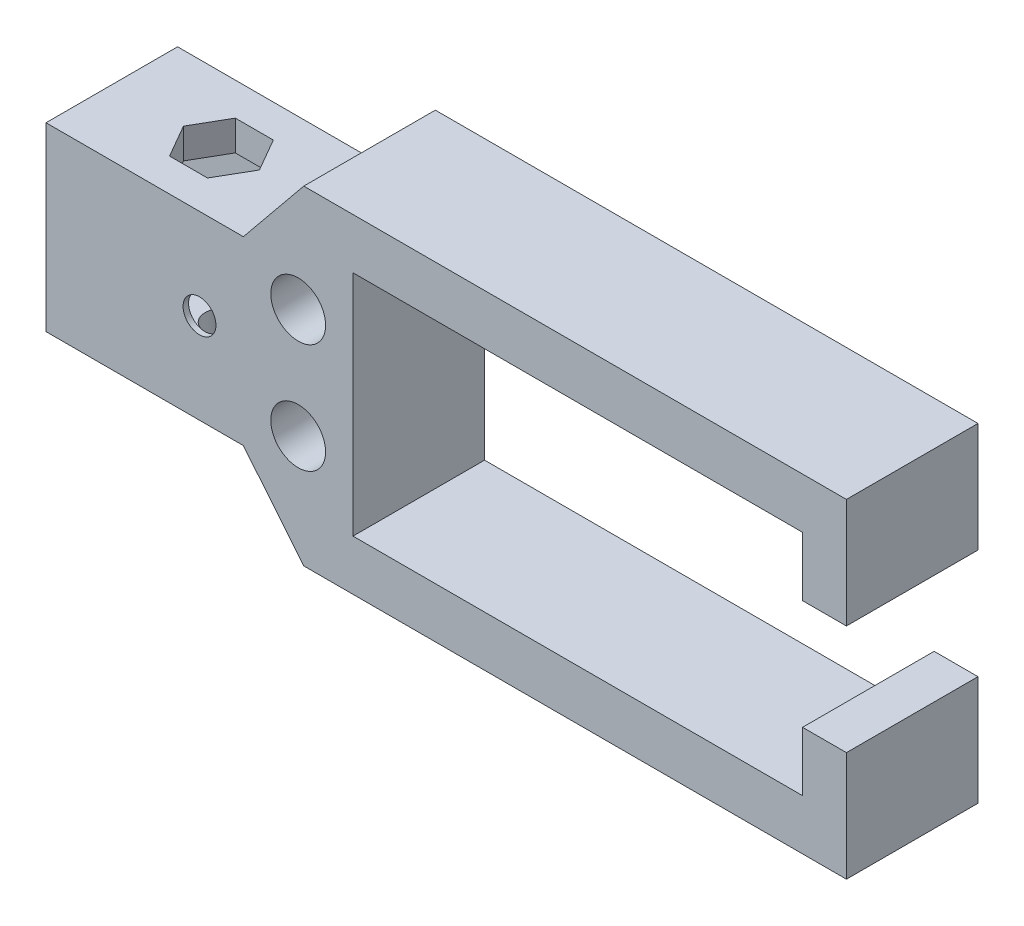
ISO-10303-21;
HEADER;
FILE_DESCRIPTION(('STEP AP214'),'2;1');
FILE_NAME('part.step','',(''),(''),'','','');
FILE_SCHEMA(('AUTOMOTIVE_DESIGN { 1 0 10303 214 1 1 1 1 }'));
ENDSEC;
DATA;
#1=APPLICATION_CONTEXT('core data for automotive mechanical design processes');
#2=APPLICATION_PROTOCOL_DEFINITION('international standard','automotive_design',2000,#1);
#3=PRODUCT_CONTEXT('',#1,'mechanical');
#4=PRODUCT('Part','Part','',(#3));
#5=PRODUCT_RELATED_PRODUCT_CATEGORY('part','',(#4));
#6=PRODUCT_DEFINITION_FORMATION('','',#4);
#7=PRODUCT_DEFINITION_CONTEXT('part definition',#1,'design');
#8=PRODUCT_DEFINITION('design','',#6,#7);
#9=PRODUCT_DEFINITION_SHAPE('','',#8);
#10=(LENGTH_UNIT() NAMED_UNIT(*) SI_UNIT(.MILLI.,.METRE.));
#11=(NAMED_UNIT(*) PLANE_ANGLE_UNIT() SI_UNIT($,.RADIAN.));
#12=(NAMED_UNIT(*) SI_UNIT($,.STERADIAN.) SOLID_ANGLE_UNIT());
#13=UNCERTAINTY_MEASURE_WITH_UNIT(LENGTH_MEASURE(1.E-05),#10,'distance_accuracy_value','');
#14=(GEOMETRIC_REPRESENTATION_CONTEXT(3) GLOBAL_UNCERTAINTY_ASSIGNED_CONTEXT((#13)) GLOBAL_UNIT_ASSIGNED_CONTEXT((#10,
#11,#12)) REPRESENTATION_CONTEXT('',''));
#15=CARTESIAN_POINT('',(0.,0.,0.));
#16=DIRECTION('',(0.,0.,1.));
#17=DIRECTION('',(1.,0.,0.));
#18=AXIS2_PLACEMENT_3D('',#15,#16,#17);
#19=CARTESIAN_POINT('',(0.,0.,0.));
#20=DIRECTION('',(0.,0.,1.));
#21=DIRECTION('',(1.,0.,0.));
#22=AXIS2_PLACEMENT_3D('',#19,#20,#21);
#23=PLANE('',#22);
#24=CARTESIAN_POINT('',(-15.,-5.,0.));
#25=DIRECTION('',(0.,0.,-1.));
#26=DIRECTION('',(-1.,0.,0.));
#27=AXIS2_PLACEMENT_3D('',#24,#25,#26);
#28=CIRCLE('',#27,2.5);
#29=CARTESIAN_POINT('',(-17.5,-5.,0.));
#30=VERTEX_POINT('',#29);
#31=EDGE_CURVE('E272',#30,#30,#28,.T.);
#32=ORIENTED_EDGE('',*,*,#31,.F.);
#33=EDGE_LOOP('',(#32));
#34=FACE_BOUND('',#33,.T.);
#35=CARTESIAN_POINT('',(-15.,5.,0.));
#36=DIRECTION('',(0.,0.,1.));
#37=DIRECTION('',(-1.,0.,0.));
#38=AXIS2_PLACEMENT_3D('',#35,#36,#37);
#39=CIRCLE('',#38,2.5);
#40=CARTESIAN_POINT('',(-17.5,5.,0.));
#41=VERTEX_POINT('',#40);
#42=EDGE_CURVE('E268',#41,#41,#39,.T.);
#43=ORIENTED_EDGE('',*,*,#42,.T.);
#44=EDGE_LOOP('',(#43));
#45=FACE_BOUND('',#44,.T.);
#46=DIRECTION('',(-0.632264439062889,0.774752656721157,0.));
#47=VECTOR('',#46,1.);
#48=CARTESIAN_POINT('',(-20.,-8.25,0.));
#49=LINE('',#48,#47);
#50=CARTESIAN_POINT('',(-14.4914226151398,-15.,0.));
#51=VERTEX_POINT('',#50);
#52=CARTESIAN_POINT('',(-20.,-8.25,0.));
#53=VERTEX_POINT('',#52);
#54=EDGE_CURVE('E253',#51,#53,#49,.T.);
#55=ORIENTED_EDGE('',*,*,#54,.T.);
#56=DIRECTION('',(-1.,0.,0.));
#57=VECTOR('',#56,1.);
#58=CARTESIAN_POINT('',(-20.,-8.25,0.));
#59=LINE('',#58,#57);
#60=CARTESIAN_POINT('',(-38.,-8.25,0.));
#61=VERTEX_POINT('',#60);
#62=EDGE_CURVE('E397',#53,#61,#59,.T.);
#63=ORIENTED_EDGE('',*,*,#62,.T.);
#64=DIRECTION('',(0.,-1.,0.));
#65=VECTOR('',#64,1.);
#66=CARTESIAN_POINT('',(-38.,10.25,0.));
#67=LINE('',#66,#65);
#68=CARTESIAN_POINT('',(-38.,8.25,0.));
#69=VERTEX_POINT('',#68);
#70=EDGE_CURVE('E412',#69,#61,#67,.T.);
#71=ORIENTED_EDGE('',*,*,#70,.F.);
#72=DIRECTION('',(-1.,0.,0.));
#73=VECTOR('',#72,1.);
#74=CARTESIAN_POINT('',(-20.,8.25,0.));
#75=LINE('',#74,#73);
#76=CARTESIAN_POINT('',(-20.,8.25,0.));
#77=VERTEX_POINT('',#76);
#78=EDGE_CURVE('E404',#77,#69,#75,.T.);
#79=ORIENTED_EDGE('',*,*,#78,.F.);
#80=DIRECTION('',(-0.632264439062889,-0.774752656721157,0.));
#81=VECTOR('',#80,1.);
#82=CARTESIAN_POINT('',(-20.,8.25,0.));
#83=LINE('',#82,#81);
#84=CARTESIAN_POINT('',(-14.4914226151398,15.,0.));
#85=VERTEX_POINT('',#84);
#86=EDGE_CURVE('E261',#85,#77,#83,.T.);
#87=ORIENTED_EDGE('',*,*,#86,.F.);
#88=DIRECTION('',(1.,0.,0.));
#89=VECTOR('',#88,1.);
#90=CARTESIAN_POINT('',(-20.,15.,0.));
#91=LINE('',#90,#89);
#92=CARTESIAN_POINT('',(35.,15.,0.));
#93=VERTEX_POINT('',#92);
#94=EDGE_CURVE('E342',#85,#93,#91,.T.);
#95=ORIENTED_EDGE('',*,*,#94,.T.);
#96=DIRECTION('',(0.,-1.,0.));
#97=VECTOR('',#96,1.);
#98=CARTESIAN_POINT('',(35.,-15.,0.));
#99=LINE('',#98,#97);
#100=CARTESIAN_POINT('',(35.,5.,0.));
#101=VERTEX_POINT('',#100);
#102=EDGE_CURVE('E339',#93,#101,#99,.T.);
#103=ORIENTED_EDGE('',*,*,#102,.T.);
#104=DIRECTION('',(-1.,0.,0.));
#105=VECTOR('',#104,1.);
#106=CARTESIAN_POINT('',(35.,5.,0.));
#107=LINE('',#106,#105);
#108=CARTESIAN_POINT('',(31.,5.,0.));
#109=VERTEX_POINT('',#108);
#110=EDGE_CURVE('E281',#101,#109,#107,.T.);
#111=ORIENTED_EDGE('',*,*,#110,.T.);
#112=DIRECTION('',(0.,1.,0.));
#113=VECTOR('',#112,1.);
#114=CARTESIAN_POINT('',(31.,5.,0.));
#115=LINE('',#114,#113);
#116=CARTESIAN_POINT('',(31.,10.4,0.));
#117=VERTEX_POINT('',#116);
#118=EDGE_CURVE('E284',#109,#117,#115,.T.);
#119=ORIENTED_EDGE('',*,*,#118,.T.);
#120=DIRECTION('',(-1.,0.,0.));
#121=VECTOR('',#120,1.);
#122=CARTESIAN_POINT('',(31.,10.4,0.));
#123=LINE('',#122,#121);
#124=CARTESIAN_POINT('',(-10.,10.4,0.));
#125=VERTEX_POINT('',#124);
#126=EDGE_CURVE('E288',#117,#125,#123,.T.);
#127=ORIENTED_EDGE('',*,*,#126,.T.);
#128=DIRECTION('',(0.,-1.,0.));
#129=VECTOR('',#128,1.);
#130=CARTESIAN_POINT('',(-10.,10.4,0.));
#131=LINE('',#130,#129);
#132=CARTESIAN_POINT('',(-10.,-10.4,0.));
#133=VERTEX_POINT('',#132);
#134=EDGE_CURVE('E291',#125,#133,#131,.T.);
#135=ORIENTED_EDGE('',*,*,#134,.T.);
#136=DIRECTION('',(1.,0.,0.));
#137=VECTOR('',#136,1.);
#138=CARTESIAN_POINT('',(31.,-10.4,0.));
#139=LINE('',#138,#137);
#140=CARTESIAN_POINT('',(31.,-10.4,0.));
#141=VERTEX_POINT('',#140);
#142=EDGE_CURVE('E294',#133,#141,#139,.T.);
#143=ORIENTED_EDGE('',*,*,#142,.T.);
#144=DIRECTION('',(0.,1.,0.));
#145=VECTOR('',#144,1.);
#146=CARTESIAN_POINT('',(31.,-5.,0.));
#147=LINE('',#146,#145);
#148=CARTESIAN_POINT('',(31.,-5.,0.));
#149=VERTEX_POINT('',#148);
#150=EDGE_CURVE('E297',#141,#149,#147,.T.);
#151=ORIENTED_EDGE('',*,*,#150,.T.);
#152=DIRECTION('',(1.,0.,0.));
#153=VECTOR('',#152,1.);
#154=CARTESIAN_POINT('',(35.,-5.,0.));
#155=LINE('',#154,#153);
#156=CARTESIAN_POINT('',(35.,-5.,0.));
#157=VERTEX_POINT('',#156);
#158=EDGE_CURVE('E300',#149,#157,#155,.T.);
#159=ORIENTED_EDGE('',*,*,#158,.T.);
#160=CARTESIAN_POINT('',(35.,-15.,0.));
#161=VERTEX_POINT('',#160);
#162=EDGE_CURVE('E343',#157,#161,#99,.T.);
#163=ORIENTED_EDGE('',*,*,#162,.T.);
#164=DIRECTION('',(-1.,0.,0.));
#165=VECTOR('',#164,1.);
#166=CARTESIAN_POINT('',(-20.,-15.,0.));
#167=LINE('',#166,#165);
#168=EDGE_CURVE('E345',#161,#51,#167,.T.);
#169=ORIENTED_EDGE('',*,*,#168,.T.);
#170=EDGE_LOOP('',(#55,#63,#71,#79,#87,#95,#103,#111,#119,#127,#135,#143,#151,#159,#163,#169));
#171=FACE_BOUND('',#170,.T.);
#172=ADVANCED_FACE('F39',(#34,#45,#171),#23,.F.);
#173=CARTESIAN_POINT('',(0.,0.,12.));
#174=DIRECTION('',(0.,0.,1.));
#175=DIRECTION('',(1.,0.,0.));
#176=AXIS2_PLACEMENT_3D('',#173,#174,#175);
#177=PLANE('',#176);
#178=CARTESIAN_POINT('',(-24.,0.,12.));
#179=DIRECTION('',(0.,0.,1.));
#180=DIRECTION('',(1.,0.,0.));
#181=AXIS2_PLACEMENT_3D('',#178,#179,#180);
#182=CIRCLE('',#181,1.5);
#183=CARTESIAN_POINT('',(-22.5,0.,12.));
#184=VERTEX_POINT('',#183);
#185=EDGE_CURVE('E702',#184,#184,#182,.T.);
#186=ORIENTED_EDGE('',*,*,#185,.F.);
#187=EDGE_LOOP('',(#186));
#188=FACE_BOUND('',#187,.T.);
#189=CARTESIAN_POINT('',(-15.,5.,12.));
#190=DIRECTION('',(0.,0.,1.));
#191=DIRECTION('',(-1.,0.,0.));
#192=AXIS2_PLACEMENT_3D('',#189,#190,#191);
#193=CIRCLE('',#192,2.5);
#194=CARTESIAN_POINT('',(-17.5,5.,12.));
#195=VERTEX_POINT('',#194);
#196=EDGE_CURVE('E269',#195,#195,#193,.T.);
#197=ORIENTED_EDGE('',*,*,#196,.F.);
#198=EDGE_LOOP('',(#197));
#199=FACE_BOUND('',#198,.T.);
#200=CARTESIAN_POINT('',(-15.,-5.,12.));
#201=DIRECTION('',(0.,0.,-1.));
#202=DIRECTION('',(-1.,0.,0.));
#203=AXIS2_PLACEMENT_3D('',#200,#201,#202);
#204=CIRCLE('',#203,2.5);
#205=CARTESIAN_POINT('',(-17.5,-5.,12.));
#206=VERTEX_POINT('',#205);
#207=EDGE_CURVE('E275',#206,#206,#204,.T.);
#208=ORIENTED_EDGE('',*,*,#207,.T.);
#209=EDGE_LOOP('',(#208));
#210=FACE_BOUND('',#209,.T.);
#211=DIRECTION('',(-1.,0.,0.));
#212=VECTOR('',#211,1.);
#213=CARTESIAN_POINT('',(-20.,-8.25,12.));
#214=LINE('',#213,#212);
#215=CARTESIAN_POINT('',(-20.,-8.25,12.));
#216=VERTEX_POINT('',#215);
#217=CARTESIAN_POINT('',(-38.,-8.25,12.));
#218=VERTEX_POINT('',#217);
#219=EDGE_CURVE('E398',#216,#218,#214,.T.);
#220=ORIENTED_EDGE('',*,*,#219,.F.);
#221=DIRECTION('',(-0.632264439062889,0.774752656721157,0.));
#222=VECTOR('',#221,1.);
#223=CARTESIAN_POINT('',(-20.,-8.25,12.));
#224=LINE('',#223,#222);
#225=CARTESIAN_POINT('',(-14.4914226151398,-15.,12.));
#226=VERTEX_POINT('',#225);
#227=EDGE_CURVE('E254',#226,#216,#224,.T.);
#228=ORIENTED_EDGE('',*,*,#227,.F.);
#229=DIRECTION('',(1.,0.,0.));
#230=VECTOR('',#229,1.);
#231=CARTESIAN_POINT('',(-20.,-15.,12.));
#232=LINE('',#231,#230);
#233=CARTESIAN_POINT('',(35.,-15.,12.));
#234=VERTEX_POINT('',#233);
#235=EDGE_CURVE('E324',#226,#234,#232,.T.);
#236=ORIENTED_EDGE('',*,*,#235,.T.);
#237=DIRECTION('',(0.,1.,0.));
#238=VECTOR('',#237,1.);
#239=CARTESIAN_POINT('',(35.,-15.,12.));
#240=LINE('',#239,#238);
#241=CARTESIAN_POINT('',(35.,-5.,12.));
#242=VERTEX_POINT('',#241);
#243=EDGE_CURVE('E348',#234,#242,#240,.T.);
#244=ORIENTED_EDGE('',*,*,#243,.T.);
#245=DIRECTION('',(1.,0.,0.));
#246=VECTOR('',#245,1.);
#247=CARTESIAN_POINT('',(35.,-5.,12.));
#248=LINE('',#247,#246);
#249=CARTESIAN_POINT('',(31.,-5.,12.));
#250=VERTEX_POINT('',#249);
#251=EDGE_CURVE('E285',#250,#242,#248,.T.);
#252=ORIENTED_EDGE('',*,*,#251,.F.);
#253=DIRECTION('',(0.,1.,0.));
#254=VECTOR('',#253,1.);
#255=CARTESIAN_POINT('',(31.,-5.,12.));
#256=LINE('',#255,#254);
#257=CARTESIAN_POINT('',(31.,-10.4,12.));
#258=VERTEX_POINT('',#257);
#259=EDGE_CURVE('E318',#258,#250,#256,.T.);
#260=ORIENTED_EDGE('',*,*,#259,.F.);
#261=DIRECTION('',(1.,0.,0.));
#262=VECTOR('',#261,1.);
#263=CARTESIAN_POINT('',(31.,-10.4,12.));
#264=LINE('',#263,#262);
#265=CARTESIAN_POINT('',(-10.,-10.4,12.));
#266=VERTEX_POINT('',#265);
#267=EDGE_CURVE('E315',#266,#258,#264,.T.);
#268=ORIENTED_EDGE('',*,*,#267,.F.);
#269=DIRECTION('',(0.,-1.,0.));
#270=VECTOR('',#269,1.);
#271=CARTESIAN_POINT('',(-10.,10.4,12.));
#272=LINE('',#271,#270);
#273=CARTESIAN_POINT('',(-10.,10.4,12.));
#274=VERTEX_POINT('',#273);
#275=EDGE_CURVE('E312',#274,#266,#272,.T.);
#276=ORIENTED_EDGE('',*,*,#275,.F.);
#277=DIRECTION('',(-1.,0.,0.));
#278=VECTOR('',#277,1.);
#279=CARTESIAN_POINT('',(31.,10.4,12.));
#280=LINE('',#279,#278);
#281=CARTESIAN_POINT('',(31.,10.4,12.));
#282=VERTEX_POINT('',#281);
#283=EDGE_CURVE('E309',#282,#274,#280,.T.);
#284=ORIENTED_EDGE('',*,*,#283,.F.);
#285=DIRECTION('',(0.,1.,0.));
#286=VECTOR('',#285,1.);
#287=CARTESIAN_POINT('',(31.,5.,12.));
#288=LINE('',#287,#286);
#289=CARTESIAN_POINT('',(31.,5.,12.));
#290=VERTEX_POINT('',#289);
#291=EDGE_CURVE('E306',#290,#282,#288,.T.);
#292=ORIENTED_EDGE('',*,*,#291,.F.);
#293=DIRECTION('',(-1.,0.,0.));
#294=VECTOR('',#293,1.);
#295=CARTESIAN_POINT('',(35.,5.,12.));
#296=LINE('',#295,#294);
#297=CARTESIAN_POINT('',(35.,5.,12.));
#298=VERTEX_POINT('',#297);
#299=EDGE_CURVE('E278',#298,#290,#296,.T.);
#300=ORIENTED_EDGE('',*,*,#299,.F.);
#301=CARTESIAN_POINT('',(35.,15.,12.));
#302=VERTEX_POINT('',#301);
#303=EDGE_CURVE('E347',#298,#302,#240,.T.);
#304=ORIENTED_EDGE('',*,*,#303,.T.);
#305=DIRECTION('',(-1.,0.,0.));
#306=VECTOR('',#305,1.);
#307=CARTESIAN_POINT('',(-20.,15.,12.));
#308=LINE('',#307,#306);
#309=CARTESIAN_POINT('',(-14.4914226151398,15.,12.));
#310=VERTEX_POINT('',#309);
#311=EDGE_CURVE('E351',#302,#310,#308,.T.);
#312=ORIENTED_EDGE('',*,*,#311,.T.);
#313=DIRECTION('',(-0.632264439062889,-0.774752656721157,0.));
#314=VECTOR('',#313,1.);
#315=CARTESIAN_POINT('',(-20.,8.25,12.));
#316=LINE('',#315,#314);
#317=CARTESIAN_POINT('',(-20.,8.25,12.));
#318=VERTEX_POINT('',#317);
#319=EDGE_CURVE('E262',#310,#318,#316,.T.);
#320=ORIENTED_EDGE('',*,*,#319,.T.);
#321=DIRECTION('',(-1.,0.,0.));
#322=VECTOR('',#321,1.);
#323=CARTESIAN_POINT('',(-20.,8.25,12.));
#324=LINE('',#323,#322);
#325=CARTESIAN_POINT('',(-38.,8.25,12.));
#326=VERTEX_POINT('',#325);
#327=EDGE_CURVE('E405',#318,#326,#324,.T.);
#328=ORIENTED_EDGE('',*,*,#327,.T.);
#329=DIRECTION('',(0.,1.,0.));
#330=VECTOR('',#329,1.);
#331=CARTESIAN_POINT('',(-38.,-5.,12.));
#332=LINE('',#331,#330);
#333=EDGE_CURVE('E415',#218,#326,#332,.T.);
#334=ORIENTED_EDGE('',*,*,#333,.F.);
#335=EDGE_LOOP('',(#220,#228,#236,#244,#252,#260,#268,#276,#284,#292,#300,#304,#312,#320,#328,#334));
#336=FACE_BOUND('',#335,.T.);
#337=ADVANCED_FACE('F426',(#188,#199,#210,#336),#177,.T.);
#338=CARTESIAN_POINT('',(-20.,-15.,-62.6498204307083));
#339=DIRECTION('',(0.,-1.,0.));
#340=DIRECTION('',(0.,0.,-1.));
#341=AXIS2_PLACEMENT_3D('',#338,#339,#340);
#342=PLANE('',#341);
#343=ORIENTED_EDGE('',*,*,#235,.F.);
#344=DIRECTION('',(0.,0.,-1.));
#345=VECTOR('',#344,1.);
#346=CARTESIAN_POINT('',(-14.4914226151398,-15.,12.));
#347=LINE('',#346,#345);
#348=EDGE_CURVE('E256',#226,#51,#347,.T.);
#349=ORIENTED_EDGE('',*,*,#348,.T.);
#350=ORIENTED_EDGE('',*,*,#168,.F.);
#351=DIRECTION('',(0.,0.,1.));
#352=VECTOR('',#351,1.);
#353=CARTESIAN_POINT('',(35.,-15.,-62.6498204307083));
#354=LINE('',#353,#352);
#355=EDGE_CURVE('E354',#161,#234,#354,.T.);
#356=ORIENTED_EDGE('',*,*,#355,.T.);
#357=EDGE_LOOP('',(#343,#349,#350,#356));
#358=FACE_BOUND('',#357,.T.);
#359=ADVANCED_FACE('F478',(#358),#342,.T.);
#360=CARTESIAN_POINT('',(35.,-15.,-62.6498204307083));
#361=DIRECTION('',(1.,0.,0.));
#362=DIRECTION('',(0.,0.,-1.));
#363=AXIS2_PLACEMENT_3D('',#360,#361,#362);
#364=PLANE('',#363);
#365=DIRECTION('',(0.,0.,1.));
#366=VECTOR('',#365,1.);
#367=CARTESIAN_POINT('',(35.,5.,0.));
#368=LINE('',#367,#366);
#369=EDGE_CURVE('E322',#101,#298,#368,.T.);
#370=ORIENTED_EDGE('',*,*,#369,.F.);
#371=ORIENTED_EDGE('',*,*,#102,.F.);
#372=DIRECTION('',(0.,0.,1.));
#373=VECTOR('',#372,1.);
#374=CARTESIAN_POINT('',(35.,15.,-62.6498204307083));
#375=LINE('',#374,#373);
#376=EDGE_CURVE('E355',#93,#302,#375,.T.);
#377=ORIENTED_EDGE('',*,*,#376,.T.);
#378=ORIENTED_EDGE('',*,*,#303,.F.);
#379=EDGE_LOOP('',(#370,#371,#377,#378));
#380=FACE_BOUND('',#379,.T.);
#381=ADVANCED_FACE('F440',(#380),#364,.T.);
#382=CARTESIAN_POINT('',(-38.,0.,0.));
#383=DIRECTION('',(-1.,0.,0.));
#384=DIRECTION('',(0.,0.,1.));
#385=AXIS2_PLACEMENT_3D('',#382,#383,#384);
#386=PLANE('',#385);
#387=DIRECTION('',(0.,0.,1.));
#388=VECTOR('',#387,1.);
#389=CARTESIAN_POINT('',(-38.,-5.5,0.500000000000001));
#390=LINE('',#389,#388);
#391=CARTESIAN_POINT('',(-38.,-5.5,0.500000000000001));
#392=VERTEX_POINT('',#391);
#393=CARTESIAN_POINT('',(-38.,-5.5,11.5));
#394=VERTEX_POINT('',#393);
#395=EDGE_CURVE('E369',#392,#394,#390,.T.);
#396=ORIENTED_EDGE('',*,*,#395,.F.);
#397=DIRECTION('',(0.,-1.,0.));
#398=VECTOR('',#397,1.);
#399=CARTESIAN_POINT('',(-38.,-5.5,0.500000000000001));
#400=LINE('',#399,#398);
#401=CARTESIAN_POINT('',(-38.,5.5,0.500000000000001));
#402=VERTEX_POINT('',#401);
#403=EDGE_CURVE('E362',#402,#392,#400,.T.);
#404=ORIENTED_EDGE('',*,*,#403,.F.);
#405=DIRECTION('',(0.,0.,-1.));
#406=VECTOR('',#405,1.);
#407=CARTESIAN_POINT('',(-38.,5.5,0.500000000000001));
#408=LINE('',#407,#406);
#409=CARTESIAN_POINT('',(-38.,5.5,11.5));
#410=VERTEX_POINT('',#409);
#411=EDGE_CURVE('E363',#410,#402,#408,.T.);
#412=ORIENTED_EDGE('',*,*,#411,.F.);
#413=DIRECTION('',(0.,1.,0.));
#414=VECTOR('',#413,1.);
#415=CARTESIAN_POINT('',(-38.,-5.5,11.5));
#416=LINE('',#415,#414);
#417=EDGE_CURVE('E366',#394,#410,#416,.T.);
#418=ORIENTED_EDGE('',*,*,#417,.F.);
#419=EDGE_LOOP('',(#396,#404,#412,#418));
#420=FACE_BOUND('',#419,.T.);
#421=ORIENTED_EDGE('',*,*,#70,.T.);
#422=DIRECTION('',(0.,0.,1.));
#423=VECTOR('',#422,1.);
#424=CARTESIAN_POINT('',(-38.,-8.25,0.));
#425=LINE('',#424,#423);
#426=EDGE_CURVE('E11',#61,#218,#425,.T.);
#427=ORIENTED_EDGE('',*,*,#426,.T.);
#428=ORIENTED_EDGE('',*,*,#333,.T.);
#429=DIRECTION('',(0.,0.,1.));
#430=VECTOR('',#429,1.);
#431=CARTESIAN_POINT('',(-38.,8.25,0.));
#432=LINE('',#431,#430);
#433=EDGE_CURVE('E47',#69,#326,#432,.T.);
#434=ORIENTED_EDGE('',*,*,#433,.F.);
#435=EDGE_LOOP('',(#421,#427,#428,#434));
#436=FACE_BOUND('',#435,.T.);
#437=ADVANCED_FACE('F484',(#420,#436),#386,.T.);
#438=CARTESIAN_POINT('',(-20.,8.25,12.));
#439=DIRECTION('',(0.,-1.,0.));
#440=DIRECTION('',(0.,0.,-1.));
#441=AXIS2_PLACEMENT_3D('',#438,#439,#440);
#442=PLANE('',#441);
#443=DIRECTION('',(-0.5,0.,0.866025403784438));
#444=VECTOR('',#443,1.);
#445=CARTESIAN_POINT('',(-29.7320508075689,8.25,3.));
#446=LINE('',#445,#444);
#447=CARTESIAN_POINT('',(-29.7320508075689,8.25,3.));
#448=VERTEX_POINT('',#447);
#449=CARTESIAN_POINT('',(-31.4641016151378,8.25,6.));
#450=VERTEX_POINT('',#449);
#451=EDGE_CURVE('E232',#448,#450,#446,.T.);
#452=ORIENTED_EDGE('',*,*,#451,.F.);
#453=DIRECTION('',(-1.,0.,0.));
#454=VECTOR('',#453,1.);
#455=CARTESIAN_POINT('',(-26.2679491924311,8.25,3.));
#456=LINE('',#455,#454);
#457=CARTESIAN_POINT('',(-26.2679491924311,8.25,3.));
#458=VERTEX_POINT('',#457);
#459=EDGE_CURVE('E214',#458,#448,#456,.T.);
#460=ORIENTED_EDGE('',*,*,#459,.F.);
#461=DIRECTION('',(-0.5,0.,-0.866025403784439));
#462=VECTOR('',#461,1.);
#463=CARTESIAN_POINT('',(-24.5358983848622,8.25,6.));
#464=LINE('',#463,#462);
#465=CARTESIAN_POINT('',(-24.5358983848622,8.25,6.));
#466=VERTEX_POINT('',#465);
#467=EDGE_CURVE('E222',#466,#458,#464,.T.);
#468=ORIENTED_EDGE('',*,*,#467,.F.);
#469=DIRECTION('',(0.499999999999999,0.,-0.866025403784439));
#470=VECTOR('',#469,1.);
#471=CARTESIAN_POINT('',(-26.2679491924311,8.25,9.));
#472=LINE('',#471,#470);
#473=CARTESIAN_POINT('',(-26.2679491924311,8.25,9.));
#474=VERTEX_POINT('',#473);
#475=EDGE_CURVE('E54',#474,#466,#472,.T.);
#476=ORIENTED_EDGE('',*,*,#475,.F.);
#477=DIRECTION('',(1.,0.,0.));
#478=VECTOR('',#477,1.);
#479=CARTESIAN_POINT('',(-29.7320508075689,8.25,9.));
#480=LINE('',#479,#478);
#481=CARTESIAN_POINT('',(-29.7320508075689,8.25,9.));
#482=VERTEX_POINT('',#481);
#483=EDGE_CURVE('E240',#482,#474,#480,.T.);
#484=ORIENTED_EDGE('',*,*,#483,.F.);
#485=DIRECTION('',(0.499999999999999,0.,0.866025403784439));
#486=VECTOR('',#485,1.);
#487=CARTESIAN_POINT('',(-31.4641016151378,8.25,6.));
#488=LINE('',#487,#486);
#489=EDGE_CURVE('E234',#450,#482,#488,.T.);
#490=ORIENTED_EDGE('',*,*,#489,.F.);
#491=EDGE_LOOP('',(#452,#460,#468,#476,#484,#490));
#492=FACE_BOUND('',#491,.T.);
#493=ORIENTED_EDGE('',*,*,#433,.T.);
#494=ORIENTED_EDGE('',*,*,#327,.F.);
#495=DIRECTION('',(0.,0.,-1.));
#496=VECTOR('',#495,1.);
#497=CARTESIAN_POINT('',(-20.,8.25,12.));
#498=LINE('',#497,#496);
#499=EDGE_CURVE('E408',#318,#77,#498,.T.);
#500=ORIENTED_EDGE('',*,*,#499,.T.);
#501=ORIENTED_EDGE('',*,*,#78,.T.);
#502=EDGE_LOOP('',(#493,#494,#500,#501));
#503=FACE_BOUND('',#502,.T.);
#504=ADVANCED_FACE('F228',(#492,#503),#442,.F.);
#505=CARTESIAN_POINT('',(-20.,-8.25,12.));
#506=DIRECTION('',(0.,-1.,0.));
#507=DIRECTION('',(0.,0.,-1.));
#508=AXIS2_PLACEMENT_3D('',#505,#506,#507);
#509=PLANE('',#508);
#510=CARTESIAN_POINT('',(-28.,-8.25,6.));
#511=DIRECTION('',(0.,-1.,0.));
#512=DIRECTION('',(0.,0.,-1.));
#513=AXIS2_PLACEMENT_3D('',#510,#511,#512);
#514=CIRCLE('',#513,1.5);
#515=CARTESIAN_POINT('',(-28.,-8.25,4.5));
#516=VERTEX_POINT('',#515);
#517=EDGE_CURVE('E394',#516,#516,#514,.T.);
#518=ORIENTED_EDGE('',*,*,#517,.F.);
#519=EDGE_LOOP('',(#518));
#520=FACE_BOUND('',#519,.T.);
#521=ORIENTED_EDGE('',*,*,#62,.F.);
#522=DIRECTION('',(0.,0.,-1.));
#523=VECTOR('',#522,1.);
#524=CARTESIAN_POINT('',(-20.,-8.25,12.));
#525=LINE('',#524,#523);
#526=EDGE_CURVE('E400',#216,#53,#525,.T.);
#527=ORIENTED_EDGE('',*,*,#526,.F.);
#528=ORIENTED_EDGE('',*,*,#219,.T.);
#529=ORIENTED_EDGE('',*,*,#426,.F.);
#530=EDGE_LOOP('',(#521,#527,#528,#529));
#531=FACE_BOUND('',#530,.T.);
#532=ADVANCED_FACE('F483',(#520,#531),#509,.T.);
#533=CARTESIAN_POINT('',(-28.,10.25,6.));
#534=DIRECTION('',(0.,-1.,0.));
#535=DIRECTION('',(0.,0.,-1.));
#536=AXIS2_PLACEMENT_3D('',#533,#534,#535);
#537=CYLINDRICAL_SURFACE('',#536,1.5);
#538=CARTESIAN_POINT('',(-28.,-5.5,6.));
#539=DIRECTION('',(0.,-1.,0.));
#540=DIRECTION('',(0.,0.,-1.));
#541=AXIS2_PLACEMENT_3D('',#538,#539,#540);
#542=CIRCLE('',#541,1.5);
#543=CARTESIAN_POINT('',(-28.,-5.5,4.5));
#544=VERTEX_POINT('',#543);
#545=EDGE_CURVE('E42',#544,#544,#542,.F.);
#546=ORIENTED_EDGE('',*,*,#545,.T.);
#547=EDGE_LOOP('',(#546));
#548=FACE_BOUND('',#547,.T.);
#549=ORIENTED_EDGE('',*,*,#517,.T.);
#550=EDGE_LOOP('',(#549));
#551=FACE_BOUND('',#550,.T.);
#552=ADVANCED_FACE('F559',(#548,#551),#537,.F.);
#553=CARTESIAN_POINT('',(-4.44365081389595,-5.5,0.500000000000001));
#554=DIRECTION('',(0.,-1.,0.));
#555=DIRECTION('',(0.,0.,-1.));
#556=AXIS2_PLACEMENT_3D('',#553,#554,#555);
#557=PLANE('',#556);
#558=DIRECTION('',(-1.,0.,0.));
#559=VECTOR('',#558,1.);
#560=CARTESIAN_POINT('',(-4.44365081389595,-5.5,0.500000000000001));
#561=LINE('',#560,#559);
#562=CARTESIAN_POINT('',(-20.,-5.5,0.500000000000001));
#563=VERTEX_POINT('',#562);
#564=EDGE_CURVE('E380',#563,#392,#561,.T.);
#565=ORIENTED_EDGE('',*,*,#564,.T.);
#566=ORIENTED_EDGE('',*,*,#395,.T.);
#567=DIRECTION('',(-1.,0.,0.));
#568=VECTOR('',#567,1.);
#569=CARTESIAN_POINT('',(-4.44365081389595,-5.5,11.5));
#570=LINE('',#569,#568);
#571=CARTESIAN_POINT('',(-20.,-5.5,11.5));
#572=VERTEX_POINT('',#571);
#573=EDGE_CURVE('E376',#572,#394,#570,.T.);
#574=ORIENTED_EDGE('',*,*,#573,.F.);
#575=DIRECTION('',(0.,0.,1.));
#576=VECTOR('',#575,1.);
#577=CARTESIAN_POINT('',(-20.,-5.5,0.500000000000001));
#578=LINE('',#577,#576);
#579=EDGE_CURVE('E365',#563,#572,#578,.T.);
#580=ORIENTED_EDGE('',*,*,#579,.F.);
#581=EDGE_LOOP('',(#565,#566,#574,#580));
#582=FACE_BOUND('',#581,.T.);
#583=ORIENTED_EDGE('',*,*,#545,.F.);
#584=EDGE_LOOP('',(#583));
#585=FACE_BOUND('',#584,.T.);
#586=ADVANCED_FACE('F552',(#582,#585),#557,.F.);
#587=CARTESIAN_POINT('',(-4.44365081389595,5.5,0.500000000000001));
#588=DIRECTION('',(0.,1.,0.));
#589=DIRECTION('',(0.,0.,1.));
#590=AXIS2_PLACEMENT_3D('',#587,#588,#589);
#591=PLANE('',#590);
#592=DIRECTION('',(0.5,0.,0.866025403784439));
#593=VECTOR('',#592,1.);
#594=CARTESIAN_POINT('',(-24.5358983848622,5.5,6.));
#595=LINE('',#594,#593);
#596=CARTESIAN_POINT('',(-26.2679491924311,5.5,3.));
#597=VERTEX_POINT('',#596);
#598=CARTESIAN_POINT('',(-24.5358983848622,5.5,6.));
#599=VERTEX_POINT('',#598);
#600=EDGE_CURVE('E226',#597,#599,#595,.T.);
#601=ORIENTED_EDGE('',*,*,#600,.F.);
#602=DIRECTION('',(1.,0.,0.));
#603=VECTOR('',#602,1.);
#604=CARTESIAN_POINT('',(-26.2679491924311,5.5,3.));
#605=LINE('',#604,#603);
#606=CARTESIAN_POINT('',(-29.7320508075689,5.5,3.));
#607=VERTEX_POINT('',#606);
#608=EDGE_CURVE('E62',#607,#597,#605,.T.);
#609=ORIENTED_EDGE('',*,*,#608,.F.);
#610=DIRECTION('',(0.5,0.,-0.866025403784439));
#611=VECTOR('',#610,1.);
#612=CARTESIAN_POINT('',(-29.7320508075689,5.5,3.));
#613=LINE('',#612,#611);
#614=CARTESIAN_POINT('',(-31.4641016151378,5.5,6.));
#615=VERTEX_POINT('',#614);
#616=EDGE_CURVE('E706',#615,#607,#613,.T.);
#617=ORIENTED_EDGE('',*,*,#616,.F.);
#618=DIRECTION('',(-0.499999999999999,0.,-0.866025403784439));
#619=VECTOR('',#618,1.);
#620=CARTESIAN_POINT('',(-31.4641016151378,5.5,6.));
#621=LINE('',#620,#619);
#622=CARTESIAN_POINT('',(-29.7320508075689,5.5,9.));
#623=VERTEX_POINT('',#622);
#624=EDGE_CURVE('E709',#623,#615,#621,.T.);
#625=ORIENTED_EDGE('',*,*,#624,.F.);
#626=DIRECTION('',(-1.,0.,0.));
#627=VECTOR('',#626,1.);
#628=CARTESIAN_POINT('',(-29.7320508075689,5.5,9.));
#629=LINE('',#628,#627);
#630=CARTESIAN_POINT('',(-26.2679491924311,5.5,9.));
#631=VERTEX_POINT('',#630);
#632=EDGE_CURVE('E715',#631,#623,#629,.T.);
#633=ORIENTED_EDGE('',*,*,#632,.F.);
#634=DIRECTION('',(-0.5,0.,0.866025403784439));
#635=VECTOR('',#634,1.);
#636=CARTESIAN_POINT('',(-26.2679491924311,5.5,9.));
#637=LINE('',#636,#635);
#638=EDGE_CURVE('E718',#599,#631,#637,.T.);
#639=ORIENTED_EDGE('',*,*,#638,.F.);
#640=EDGE_LOOP('',(#601,#609,#617,#625,#633,#639));
#641=FACE_BOUND('',#640,.T.);
#642=DIRECTION('',(-1.,0.,0.));
#643=VECTOR('',#642,1.);
#644=CARTESIAN_POINT('',(-4.44365081389595,5.5,11.5));
#645=LINE('',#644,#643);
#646=CARTESIAN_POINT('',(-20.,5.5,11.5));
#647=VERTEX_POINT('',#646);
#648=EDGE_CURVE('E385',#647,#410,#645,.T.);
#649=ORIENTED_EDGE('',*,*,#648,.T.);
#650=ORIENTED_EDGE('',*,*,#411,.T.);
#651=DIRECTION('',(-1.,0.,0.));
#652=VECTOR('',#651,1.);
#653=CARTESIAN_POINT('',(-4.44365081389595,5.5,0.500000000000001));
#654=LINE('',#653,#652);
#655=CARTESIAN_POINT('',(-20.,5.5,0.500000000000001));
#656=VERTEX_POINT('',#655);
#657=EDGE_CURVE('E381',#656,#402,#654,.T.);
#658=ORIENTED_EDGE('',*,*,#657,.F.);
#659=DIRECTION('',(0.,0.,-1.));
#660=VECTOR('',#659,1.);
#661=CARTESIAN_POINT('',(-20.,5.5,0.500000000000001));
#662=LINE('',#661,#660);
#663=EDGE_CURVE('E382',#647,#656,#662,.T.);
#664=ORIENTED_EDGE('',*,*,#663,.F.);
#665=EDGE_LOOP('',(#649,#650,#658,#664));
#666=FACE_BOUND('',#665,.T.);
#667=ADVANCED_FACE('F549',(#641,#666),#591,.F.);
#668=CARTESIAN_POINT('',(-4.44365081389595,-5.5,11.5));
#669=DIRECTION('',(0.,0.,1.));
#670=DIRECTION('',(1.,0.,0.));
#671=AXIS2_PLACEMENT_3D('',#668,#669,#670);
#672=PLANE('',#671);
#673=CARTESIAN_POINT('',(-24.,0.,11.5));
#674=DIRECTION('',(0.,0.,1.));
#675=DIRECTION('',(1.,0.,0.));
#676=AXIS2_PLACEMENT_3D('',#673,#674,#675);
#677=CIRCLE('',#676,1.5);
#678=CARTESIAN_POINT('',(-22.5,0.,11.5));
#679=VERTEX_POINT('',#678);
#680=EDGE_CURVE('E705',#679,#679,#677,.F.);
#681=ORIENTED_EDGE('',*,*,#680,.F.);
#682=EDGE_LOOP('',(#681));
#683=FACE_BOUND('',#682,.T.);
#684=ORIENTED_EDGE('',*,*,#573,.T.);
#685=ORIENTED_EDGE('',*,*,#417,.T.);
#686=ORIENTED_EDGE('',*,*,#648,.F.);
#687=DIRECTION('',(0.,1.,0.));
#688=VECTOR('',#687,1.);
#689=CARTESIAN_POINT('',(-20.,-5.5,11.5));
#690=LINE('',#689,#688);
#691=EDGE_CURVE('E386',#572,#647,#690,.T.);
#692=ORIENTED_EDGE('',*,*,#691,.F.);
#693=EDGE_LOOP('',(#684,#685,#686,#692));
#694=FACE_BOUND('',#693,.T.);
#695=ADVANCED_FACE('F547',(#683,#694),#672,.F.);
#696=CARTESIAN_POINT('',(-4.44365081389595,-5.5,0.500000000000001));
#697=DIRECTION('',(0.,0.,-1.));
#698=DIRECTION('',(-1.,0.,0.));
#699=AXIS2_PLACEMENT_3D('',#696,#697,#698);
#700=PLANE('',#699);
#701=ORIENTED_EDGE('',*,*,#657,.T.);
#702=ORIENTED_EDGE('',*,*,#403,.T.);
#703=ORIENTED_EDGE('',*,*,#564,.F.);
#704=DIRECTION('',(0.,-1.,0.));
#705=VECTOR('',#704,1.);
#706=CARTESIAN_POINT('',(-20.,-5.5,0.500000000000001));
#707=LINE('',#706,#705);
#708=EDGE_CURVE('E377',#656,#563,#707,.T.);
#709=ORIENTED_EDGE('',*,*,#708,.F.);
#710=EDGE_LOOP('',(#701,#702,#703,#709));
#711=FACE_BOUND('',#710,.T.);
#712=ADVANCED_FACE('F544',(#711),#700,.F.);
#713=CARTESIAN_POINT('',(-20.,0.,0.));
#714=DIRECTION('',(1.,0.,0.));
#715=DIRECTION('',(0.,0.,-1.));
#716=AXIS2_PLACEMENT_3D('',#713,#714,#715);
#717=PLANE('',#716);
#718=ORIENTED_EDGE('',*,*,#708,.T.);
#719=ORIENTED_EDGE('',*,*,#579,.T.);
#720=ORIENTED_EDGE('',*,*,#691,.T.);
#721=ORIENTED_EDGE('',*,*,#663,.T.);
#722=EDGE_LOOP('',(#718,#719,#720,#721));
#723=FACE_BOUND('',#722,.T.);
#724=ADVANCED_FACE('F541',(#723),#717,.F.);
#725=DIRECTION('',(0.,0.,1.));
#726=VECTOR('',#725,1.);
#727=CARTESIAN_POINT('',(35.,-5.,0.));
#728=LINE('',#727,#726);
#729=EDGE_CURVE('E325',#157,#242,#728,.T.);
#730=ORIENTED_EDGE('',*,*,#729,.T.);
#731=ORIENTED_EDGE('',*,*,#243,.F.);
#732=ORIENTED_EDGE('',*,*,#355,.F.);
#733=ORIENTED_EDGE('',*,*,#162,.F.);
#734=EDGE_LOOP('',(#730,#731,#732,#733));
#735=FACE_BOUND('',#734,.T.);
#736=ADVANCED_FACE('F472',(#735),#364,.T.);
#737=CARTESIAN_POINT('',(-20.,15.,-62.6498204307083));
#738=DIRECTION('',(0.,1.,0.));
#739=DIRECTION('',(0.,0.,1.));
#740=AXIS2_PLACEMENT_3D('',#737,#738,#739);
#741=PLANE('',#740);
#742=DIRECTION('',(0.,0.,-1.));
#743=VECTOR('',#742,1.);
#744=CARTESIAN_POINT('',(-14.4914226151398,15.,12.));
#745=LINE('',#744,#743);
#746=EDGE_CURVE('E265',#310,#85,#745,.T.);
#747=ORIENTED_EDGE('',*,*,#746,.F.);
#748=ORIENTED_EDGE('',*,*,#311,.F.);
#749=ORIENTED_EDGE('',*,*,#376,.F.);
#750=ORIENTED_EDGE('',*,*,#94,.F.);
#751=EDGE_LOOP('',(#747,#748,#749,#750));
#752=FACE_BOUND('',#751,.T.);
#753=ADVANCED_FACE('F434',(#752),#741,.T.);
#754=CARTESIAN_POINT('',(35.,5.,0.));
#755=DIRECTION('',(0.,1.,0.));
#756=DIRECTION('',(-1.,0.,0.));
#757=AXIS2_PLACEMENT_3D('',#754,#755,#756);
#758=PLANE('',#757);
#759=ORIENTED_EDGE('',*,*,#299,.T.);
#760=DIRECTION('',(0.,0.,1.));
#761=VECTOR('',#760,1.);
#762=CARTESIAN_POINT('',(31.,5.,0.));
#763=LINE('',#762,#761);
#764=EDGE_CURVE('E303',#109,#290,#763,.T.);
#765=ORIENTED_EDGE('',*,*,#764,.F.);
#766=ORIENTED_EDGE('',*,*,#110,.F.);
#767=ORIENTED_EDGE('',*,*,#369,.T.);
#768=EDGE_LOOP('',(#759,#765,#766,#767));
#769=FACE_BOUND('',#768,.T.);
#770=ADVANCED_FACE('F444',(#769),#758,.F.);
#771=CARTESIAN_POINT('',(35.,-5.,0.));
#772=DIRECTION('',(0.,-1.,0.));
#773=DIRECTION('',(1.,0.,0.));
#774=AXIS2_PLACEMENT_3D('',#771,#772,#773);
#775=PLANE('',#774);
#776=ORIENTED_EDGE('',*,*,#251,.T.);
#777=ORIENTED_EDGE('',*,*,#729,.F.);
#778=ORIENTED_EDGE('',*,*,#158,.F.);
#779=DIRECTION('',(0.,0.,1.));
#780=VECTOR('',#779,1.);
#781=CARTESIAN_POINT('',(31.,-5.,0.));
#782=LINE('',#781,#780);
#783=EDGE_CURVE('E328',#149,#250,#782,.T.);
#784=ORIENTED_EDGE('',*,*,#783,.T.);
#785=EDGE_LOOP('',(#776,#777,#778,#784));
#786=FACE_BOUND('',#785,.T.);
#787=ADVANCED_FACE('F469',(#786),#775,.F.);
#788=CARTESIAN_POINT('',(31.,-5.,0.));
#789=DIRECTION('',(1.,0.,0.));
#790=DIRECTION('',(0.,0.,-1.));
#791=AXIS2_PLACEMENT_3D('',#788,#789,#790);
#792=PLANE('',#791);
#793=ORIENTED_EDGE('',*,*,#259,.T.);
#794=ORIENTED_EDGE('',*,*,#783,.F.);
#795=ORIENTED_EDGE('',*,*,#150,.F.);
#796=DIRECTION('',(0.,0.,1.));
#797=VECTOR('',#796,1.);
#798=CARTESIAN_POINT('',(31.,-10.4,0.));
#799=LINE('',#798,#797);
#800=EDGE_CURVE('E330',#141,#258,#799,.T.);
#801=ORIENTED_EDGE('',*,*,#800,.T.);
#802=EDGE_LOOP('',(#793,#794,#795,#801));
#803=FACE_BOUND('',#802,.T.);
#804=ADVANCED_FACE('F465',(#803),#792,.F.);
#805=CARTESIAN_POINT('',(31.,-10.4,0.));
#806=DIRECTION('',(0.,-1.,0.));
#807=DIRECTION('',(1.,0.,0.));
#808=AXIS2_PLACEMENT_3D('',#805,#806,#807);
#809=PLANE('',#808);
#810=ORIENTED_EDGE('',*,*,#267,.T.);
#811=ORIENTED_EDGE('',*,*,#800,.F.);
#812=ORIENTED_EDGE('',*,*,#142,.F.);
#813=DIRECTION('',(0.,0.,1.));
#814=VECTOR('',#813,1.);
#815=CARTESIAN_POINT('',(-10.,-10.4,0.));
#816=LINE('',#815,#814);
#817=EDGE_CURVE('E332',#133,#266,#816,.T.);
#818=ORIENTED_EDGE('',*,*,#817,.T.);
#819=EDGE_LOOP('',(#810,#811,#812,#818));
#820=FACE_BOUND('',#819,.T.);
#821=ADVANCED_FACE('F460',(#820),#809,.F.);
#822=CARTESIAN_POINT('',(-10.,10.4,0.));
#823=DIRECTION('',(-1.,0.,0.));
#824=DIRECTION('',(0.,0.,1.));
#825=AXIS2_PLACEMENT_3D('',#822,#823,#824);
#826=PLANE('',#825);
#827=ORIENTED_EDGE('',*,*,#275,.T.);
#828=ORIENTED_EDGE('',*,*,#817,.F.);
#829=ORIENTED_EDGE('',*,*,#134,.F.);
#830=DIRECTION('',(0.,0.,1.));
#831=VECTOR('',#830,1.);
#832=CARTESIAN_POINT('',(-10.,10.4,0.));
#833=LINE('',#832,#831);
#834=EDGE_CURVE('E334',#125,#274,#833,.T.);
#835=ORIENTED_EDGE('',*,*,#834,.T.);
#836=EDGE_LOOP('',(#827,#828,#829,#835));
#837=FACE_BOUND('',#836,.T.);
#838=ADVANCED_FACE('F456',(#837),#826,.F.);
#839=CARTESIAN_POINT('',(31.,10.4,0.));
#840=DIRECTION('',(0.,1.,0.));
#841=DIRECTION('',(-1.,0.,0.));
#842=AXIS2_PLACEMENT_3D('',#839,#840,#841);
#843=PLANE('',#842);
#844=ORIENTED_EDGE('',*,*,#283,.T.);
#845=ORIENTED_EDGE('',*,*,#834,.F.);
#846=ORIENTED_EDGE('',*,*,#126,.F.);
#847=DIRECTION('',(0.,0.,1.));
#848=VECTOR('',#847,1.);
#849=CARTESIAN_POINT('',(31.,10.4,0.));
#850=LINE('',#849,#848);
#851=EDGE_CURVE('E336',#117,#282,#850,.T.);
#852=ORIENTED_EDGE('',*,*,#851,.T.);
#853=EDGE_LOOP('',(#844,#845,#846,#852));
#854=FACE_BOUND('',#853,.T.);
#855=ADVANCED_FACE('F454',(#854),#843,.F.);
#856=CARTESIAN_POINT('',(31.,5.,0.));
#857=DIRECTION('',(1.,0.,0.));
#858=DIRECTION('',(0.,0.,-1.));
#859=AXIS2_PLACEMENT_3D('',#856,#857,#858);
#860=PLANE('',#859);
#861=ORIENTED_EDGE('',*,*,#291,.T.);
#862=ORIENTED_EDGE('',*,*,#851,.F.);
#863=ORIENTED_EDGE('',*,*,#118,.F.);
#864=ORIENTED_EDGE('',*,*,#764,.T.);
#865=EDGE_LOOP('',(#861,#862,#863,#864));
#866=FACE_BOUND('',#865,.T.);
#867=ADVANCED_FACE('F449',(#866),#860,.F.);
#868=CARTESIAN_POINT('',(-15.,-5.,12.));
#869=DIRECTION('',(0.,0.,-1.));
#870=DIRECTION('',(-1.,0.,0.));
#871=AXIS2_PLACEMENT_3D('',#868,#869,#870);
#872=CYLINDRICAL_SURFACE('',#871,2.5);
#873=ORIENTED_EDGE('',*,*,#207,.F.);
#874=EDGE_LOOP('',(#873));
#875=FACE_BOUND('',#874,.T.);
#876=ORIENTED_EDGE('',*,*,#31,.T.);
#877=EDGE_LOOP('',(#876));
#878=FACE_BOUND('',#877,.T.);
#879=ADVANCED_FACE('F511',(#875,#878),#872,.F.);
#880=CARTESIAN_POINT('',(-15.,5.,12.));
#881=DIRECTION('',(0.,0.,-1.));
#882=DIRECTION('',(-1.,0.,0.));
#883=AXIS2_PLACEMENT_3D('',#880,#881,#882);
#884=CYLINDRICAL_SURFACE('',#883,2.5);
#885=ORIENTED_EDGE('',*,*,#196,.T.);
#886=EDGE_LOOP('',(#885));
#887=FACE_BOUND('',#886,.T.);
#888=ORIENTED_EDGE('',*,*,#42,.F.);
#889=EDGE_LOOP('',(#888));
#890=FACE_BOUND('',#889,.T.);
#891=ADVANCED_FACE('F509',(#887,#890),#884,.F.);
#892=CARTESIAN_POINT('',(-20.,8.25,12.));
#893=DIRECTION('',(0.774752656721157,-0.632264439062889,0.));
#894=DIRECTION('',(0.632264439062889,0.774752656721157,0.));
#895=AXIS2_PLACEMENT_3D('',#892,#893,#894);
#896=PLANE('',#895);
#897=ORIENTED_EDGE('',*,*,#86,.T.);
#898=ORIENTED_EDGE('',*,*,#499,.F.);
#899=ORIENTED_EDGE('',*,*,#319,.F.);
#900=ORIENTED_EDGE('',*,*,#746,.T.);
#901=EDGE_LOOP('',(#897,#898,#899,#900));
#902=FACE_BOUND('',#901,.T.);
#903=ADVANCED_FACE('F430',(#902),#896,.F.);
#904=CARTESIAN_POINT('',(-20.,-8.25,12.));
#905=DIRECTION('',(-0.774752656721157,-0.632264439062889,0.));
#906=DIRECTION('',(0.632264439062889,-0.774752656721157,0.));
#907=AXIS2_PLACEMENT_3D('',#904,#905,#906);
#908=PLANE('',#907);
#909=ORIENTED_EDGE('',*,*,#54,.F.);
#910=ORIENTED_EDGE('',*,*,#348,.F.);
#911=ORIENTED_EDGE('',*,*,#227,.T.);
#912=ORIENTED_EDGE('',*,*,#526,.T.);
#913=EDGE_LOOP('',(#909,#910,#911,#912));
#914=FACE_BOUND('',#913,.T.);
#915=ADVANCED_FACE('F518',(#914),#908,.T.);
#916=CARTESIAN_POINT('',(-26.2679491924311,-15.001,3.));
#917=DIRECTION('',(0.,0.,-1.));
#918=DIRECTION('',(-1.,0.,0.));
#919=AXIS2_PLACEMENT_3D('',#916,#917,#918);
#920=PLANE('',#919);
#921=ORIENTED_EDGE('',*,*,#608,.T.);
#922=DIRECTION('',(0.,1.,0.));
#923=VECTOR('',#922,1.);
#924=CARTESIAN_POINT('',(-26.2679491924311,-15.001,3.));
#925=LINE('',#924,#923);
#926=EDGE_CURVE('E210',#597,#458,#925,.T.);
#927=ORIENTED_EDGE('',*,*,#926,.T.);
#928=ORIENTED_EDGE('',*,*,#459,.T.);
#929=DIRECTION('',(0.,1.,0.));
#930=VECTOR('',#929,1.);
#931=CARTESIAN_POINT('',(-29.7320508075689,-15.001,3.));
#932=LINE('',#931,#930);
#933=EDGE_CURVE('E219',#607,#448,#932,.T.);
#934=ORIENTED_EDGE('',*,*,#933,.F.);
#935=EDGE_LOOP('',(#921,#927,#928,#934));
#936=FACE_BOUND('',#935,.T.);
#937=ADVANCED_FACE('F212',(#936),#920,.F.);
#938=CARTESIAN_POINT('',(-29.7320508075689,-15.001,3.));
#939=DIRECTION('',(-0.866025403784438,0.,-0.5));
#940=DIRECTION('',(-0.5,0.,0.866025403784439));
#941=AXIS2_PLACEMENT_3D('',#938,#939,#940);
#942=PLANE('',#941);
#943=ORIENTED_EDGE('',*,*,#616,.T.);
#944=ORIENTED_EDGE('',*,*,#933,.T.);
#945=ORIENTED_EDGE('',*,*,#451,.T.);
#946=DIRECTION('',(0.,1.,0.));
#947=VECTOR('',#946,1.);
#948=CARTESIAN_POINT('',(-31.4641016151378,-15.001,6.));
#949=LINE('',#948,#947);
#950=EDGE_CURVE('E249',#615,#450,#949,.T.);
#951=ORIENTED_EDGE('',*,*,#950,.F.);
#952=EDGE_LOOP('',(#943,#944,#945,#951));
#953=FACE_BOUND('',#952,.T.);
#954=ADVANCED_FACE('F640',(#953),#942,.F.);
#955=CARTESIAN_POINT('',(-31.4641016151378,-15.001,6.));
#956=DIRECTION('',(-0.866025403784439,0.,0.499999999999999));
#957=DIRECTION('',(0.499999999999999,0.,0.866025403784439));
#958=AXIS2_PLACEMENT_3D('',#955,#956,#957);
#959=PLANE('',#958);
#960=ORIENTED_EDGE('',*,*,#624,.T.);
#961=ORIENTED_EDGE('',*,*,#950,.T.);
#962=ORIENTED_EDGE('',*,*,#489,.T.);
#963=DIRECTION('',(0.,1.,0.));
#964=VECTOR('',#963,1.);
#965=CARTESIAN_POINT('',(-29.7320508075689,-15.001,9.));
#966=LINE('',#965,#964);
#967=EDGE_CURVE('E247',#623,#482,#966,.T.);
#968=ORIENTED_EDGE('',*,*,#967,.F.);
#969=EDGE_LOOP('',(#960,#961,#962,#968));
#970=FACE_BOUND('',#969,.T.);
#971=ADVANCED_FACE('F646',(#970),#959,.F.);
#972=CARTESIAN_POINT('',(-29.7320508075689,-15.001,9.));
#973=DIRECTION('',(0.,0.,1.));
#974=DIRECTION('',(1.,0.,0.));
#975=AXIS2_PLACEMENT_3D('',#972,#973,#974);
#976=PLANE('',#975);
#977=ORIENTED_EDGE('',*,*,#632,.T.);
#978=ORIENTED_EDGE('',*,*,#967,.T.);
#979=ORIENTED_EDGE('',*,*,#483,.T.);
#980=DIRECTION('',(0.,1.,0.));
#981=VECTOR('',#980,1.);
#982=CARTESIAN_POINT('',(-26.2679491924311,-15.001,9.));
#983=LINE('',#982,#981);
#984=EDGE_CURVE('E245',#631,#474,#983,.T.);
#985=ORIENTED_EDGE('',*,*,#984,.F.);
#986=EDGE_LOOP('',(#977,#978,#979,#985));
#987=FACE_BOUND('',#986,.T.);
#988=ADVANCED_FACE('F654',(#987),#976,.F.);
#989=CARTESIAN_POINT('',(-26.2679491924311,-15.001,9.));
#990=DIRECTION('',(0.866025403784439,0.,0.5));
#991=DIRECTION('',(0.5,0.,-0.866025403784439));
#992=AXIS2_PLACEMENT_3D('',#989,#990,#991);
#993=PLANE('',#992);
#994=ORIENTED_EDGE('',*,*,#638,.T.);
#995=ORIENTED_EDGE('',*,*,#984,.T.);
#996=ORIENTED_EDGE('',*,*,#475,.T.);
#997=DIRECTION('',(0.,1.,0.));
#998=VECTOR('',#997,1.);
#999=CARTESIAN_POINT('',(-24.5358983848622,-15.001,6.));
#1000=LINE('',#999,#998);
#1001=EDGE_CURVE('E224',#599,#466,#1000,.T.);
#1002=ORIENTED_EDGE('',*,*,#1001,.F.);
#1003=EDGE_LOOP('',(#994,#995,#996,#1002));
#1004=FACE_BOUND('',#1003,.T.);
#1005=ADVANCED_FACE('F662',(#1004),#993,.F.);
#1006=CARTESIAN_POINT('',(-24.5358983848622,-15.001,6.));
#1007=DIRECTION('',(0.866025403784439,0.,-0.5));
#1008=DIRECTION('',(-0.5,0.,-0.866025403784439));
#1009=AXIS2_PLACEMENT_3D('',#1006,#1007,#1008);
#1010=PLANE('',#1009);
#1011=ORIENTED_EDGE('',*,*,#600,.T.);
#1012=ORIENTED_EDGE('',*,*,#1001,.T.);
#1013=ORIENTED_EDGE('',*,*,#467,.T.);
#1014=ORIENTED_EDGE('',*,*,#926,.F.);
#1015=EDGE_LOOP('',(#1011,#1012,#1013,#1014));
#1016=FACE_BOUND('',#1015,.T.);
#1017=ADVANCED_FACE('F223',(#1016),#1010,.F.);
#1018=CARTESIAN_POINT('',(-24.,0.,-0.000999999999999265));
#1019=DIRECTION('',(0.,0.,1.));
#1020=DIRECTION('',(1.,0.,0.));
#1021=AXIS2_PLACEMENT_3D('',#1018,#1019,#1020);
#1022=CYLINDRICAL_SURFACE('',#1021,1.5);
#1023=ORIENTED_EDGE('',*,*,#185,.T.);
#1024=EDGE_LOOP('',(#1023));
#1025=FACE_BOUND('',#1024,.T.);
#1026=ORIENTED_EDGE('',*,*,#680,.T.);
#1027=EDGE_LOOP('',(#1026));
#1028=FACE_BOUND('',#1027,.T.);
#1029=ADVANCED_FACE('F676',(#1025,#1028),#1022,.F.);
#1030=CLOSED_SHELL('',(#172,#337,#359,#381,#437,#504,#532,#552,#586,#667,#695,#712,#724,#736,
#753,#770,#787,#804,#821,#838,#855,#867,#879,#891,#903,#915,#937,#954,#971,#988,#1005,#1017,#1029));
#1031=MANIFOLD_SOLID_BREP('B2',#1030);
#1032=ADVANCED_BREP_SHAPE_REPRESENTATION('',(#18,#1031),#14);
#1033=SHAPE_DEFINITION_REPRESENTATION(#9,#1032);
ENDSEC;
END-ISO-10303-21;
